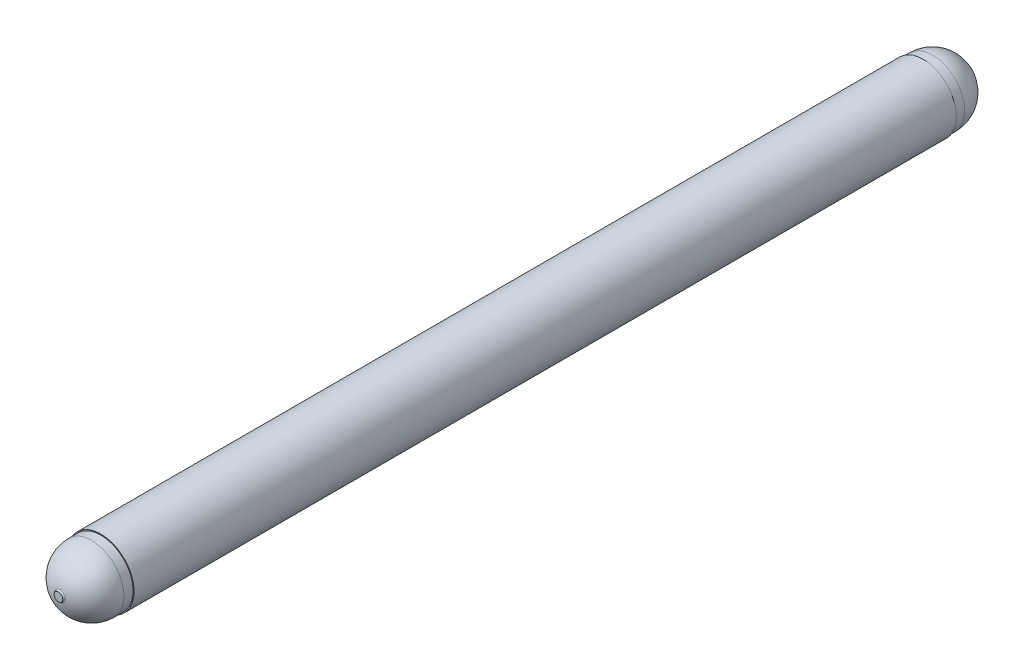
ISO-10303-21;
HEADER;
FILE_DESCRIPTION(('STEP AP214'),'2;1');
FILE_NAME('part.step','',(''),(''),'','','');
FILE_SCHEMA(('AUTOMOTIVE_DESIGN { 1 0 10303 214 1 1 1 1 }'));
ENDSEC;
DATA;
#1=APPLICATION_CONTEXT('core data for automotive mechanical design processes');
#2=APPLICATION_PROTOCOL_DEFINITION('international standard','automotive_design',2000,#1);
#3=PRODUCT_CONTEXT('',#1,'mechanical');
#4=PRODUCT('Part','Part','',(#3));
#5=PRODUCT_RELATED_PRODUCT_CATEGORY('part','',(#4));
#6=PRODUCT_DEFINITION_FORMATION('','',#4);
#7=PRODUCT_DEFINITION_CONTEXT('part definition',#1,'design');
#8=PRODUCT_DEFINITION('design','',#6,#7);
#9=PRODUCT_DEFINITION_SHAPE('','',#8);
#10=(LENGTH_UNIT() NAMED_UNIT(*) SI_UNIT(.MILLI.,.METRE.));
#11=(NAMED_UNIT(*) PLANE_ANGLE_UNIT() SI_UNIT($,.RADIAN.));
#12=(NAMED_UNIT(*) SI_UNIT($,.STERADIAN.) SOLID_ANGLE_UNIT());
#13=UNCERTAINTY_MEASURE_WITH_UNIT(LENGTH_MEASURE(1.E-05),#10,'distance_accuracy_value','');
#14=(GEOMETRIC_REPRESENTATION_CONTEXT(3) GLOBAL_UNCERTAINTY_ASSIGNED_CONTEXT((#13)) GLOBAL_UNIT_ASSIGNED_CONTEXT((#10,
#11,#12)) REPRESENTATION_CONTEXT('',''));
#15=CARTESIAN_POINT('',(0.,0.,0.));
#16=DIRECTION('',(0.,0.,1.));
#17=DIRECTION('',(1.,0.,0.));
#18=AXIS2_PLACEMENT_3D('',#15,#16,#17);
#19=CARTESIAN_POINT('',(0.,0.,-82.4767160886856));
#20=DIRECTION('',(0.,0.,-1.));
#21=DIRECTION('',(-1.,0.,0.));
#22=AXIS2_PLACEMENT_3D('',#19,#20,#21);
#23=PLANE('',#22);
#24=CARTESIAN_POINT('',(0.,0.,-82.4767160886856));
#25=DIRECTION('',(0.,0.,1.));
#26=DIRECTION('',(1.,0.,0.));
#27=AXIS2_PLACEMENT_3D('',#24,#25,#26);
#28=CIRCLE('',#27,5.725);
#29=CARTESIAN_POINT('',(5.725,0.,-82.4767160886856));
#30=VERTEX_POINT('',#29);
#31=EDGE_CURVE('E51',#30,#30,#28,.T.);
#32=ORIENTED_EDGE('',*,*,#31,.F.);
#33=EDGE_LOOP('',(#32));
#34=FACE_BOUND('',#33,.T.);
#35=ADVANCED_FACE('F30',(#34),#23,.T.);
#36=CARTESIAN_POINT('',(0.,0.,0.));
#37=DIRECTION('',(0.,0.,1.));
#38=DIRECTION('',(1.,0.,0.));
#39=AXIS2_PLACEMENT_3D('',#36,#37,#38);
#40=CYLINDRICAL_SURFACE('',#39,70.);
#41=CARTESIAN_POINT('',(0.,0.,-9.99999999999954));
#42=DIRECTION('',(0.,0.,1.));
#43=DIRECTION('',(1.,0.,0.));
#44=AXIS2_PLACEMENT_3D('',#41,#42,#43);
#45=CIRCLE('',#44,70.);
#46=CARTESIAN_POINT('',(70.,0.,-9.99999999999954));
#47=VERTEX_POINT('',#46);
#48=EDGE_CURVE('E58',#47,#47,#45,.T.);
#49=ORIENTED_EDGE('',*,*,#48,.T.);
#50=EDGE_LOOP('',(#49));
#51=FACE_BOUND('',#50,.T.);
#52=CARTESIAN_POINT('',(0.,0.,10.));
#53=DIRECTION('',(0.,0.,1.));
#54=DIRECTION('',(1.,0.,0.));
#55=AXIS2_PLACEMENT_3D('',#52,#53,#54);
#56=CIRCLE('',#55,70.);
#57=CARTESIAN_POINT('',(70.,0.,10.));
#58=VERTEX_POINT('',#57);
#59=EDGE_CURVE('E55',#58,#58,#56,.T.);
#60=ORIENTED_EDGE('',*,*,#59,.F.);
#61=EDGE_LOOP('',(#60));
#62=FACE_BOUND('',#61,.T.);
#63=ADVANCED_FACE('F72',(#51,#62),#40,.T.);
#64=CARTESIAN_POINT('',(0.,0.,-9.99999999999955));
#65=DIRECTION('',(0.,0.,1.));
#66=DIRECTION('',(-1.,0.,0.));
#67=AXIS2_PLACEMENT_3D('',#64,#65,#66);
#68=SPHERICAL_SURFACE('',#67,70.);
#69=CARTESIAN_POINT('',(0.,0.,-79.4982209069587));
#70=DIRECTION('',(0.,0.,1.));
#71=DIRECTION('',(1.,0.,0.));
#72=AXIS2_PLACEMENT_3D('',#69,#70,#71);
#73=CIRCLE('',#72,8.36643835616438);
#74=CARTESIAN_POINT('',(8.36643835616438,0.,-79.4982209069587));
#75=VERTEX_POINT('',#74);
#76=EDGE_CURVE('E34',#75,#75,#73,.F.);
#77=ORIENTED_EDGE('',*,*,#76,.F.);
#78=EDGE_LOOP('',(#77));
#79=FACE_BOUND('',#78,.T.);
#80=ORIENTED_EDGE('',*,*,#48,.F.);
#81=EDGE_LOOP('',(#80));
#82=FACE_BOUND('',#81,.T.);
#83=ADVANCED_FACE('F68',(#79,#82),#68,.T.);
#84=CARTESIAN_POINT('',(-72.,0.,10.));
#85=DIRECTION('',(0.,0.,-1.));
#86=DIRECTION('',(-1.,0.,0.));
#87=AXIS2_PLACEMENT_3D('',#84,#85,#86);
#88=PLANE('',#87);
#89=ORIENTED_EDGE('',*,*,#59,.T.);
#90=EDGE_LOOP('',(#89));
#91=FACE_BOUND('',#90,.T.);
#92=CARTESIAN_POINT('',(0.,0.,10.));
#93=DIRECTION('',(0.,0.,1.));
#94=DIRECTION('',(1.,0.,0.));
#95=AXIS2_PLACEMENT_3D('',#92,#93,#94);
#96=CIRCLE('',#95,72.);
#97=CARTESIAN_POINT('',(72.,0.,10.));
#98=VERTEX_POINT('',#97);
#99=EDGE_CURVE('E50',#98,#98,#96,.T.);
#100=ORIENTED_EDGE('',*,*,#99,.F.);
#101=EDGE_LOOP('',(#100));
#102=FACE_BOUND('',#101,.T.);
#103=ADVANCED_FACE('F71',(#91,#102),#88,.T.);
#104=CARTESIAN_POINT('',(0.,0.,-82.4767160886856));
#105=DIRECTION('',(0.,0.,1.));
#106=DIRECTION('',(1.,0.,0.));
#107=AXIS2_PLACEMENT_3D('',#104,#105,#106);
#108=TOROIDAL_SURFACE('',#107,8.725,3.);
#109=ORIENTED_EDGE('',*,*,#76,.T.);
#110=EDGE_LOOP('',(#109));
#111=FACE_BOUND('',#110,.T.);
#112=ORIENTED_EDGE('',*,*,#31,.T.);
#113=EDGE_LOOP('',(#112));
#114=FACE_BOUND('',#113,.T.);
#115=ADVANCED_FACE('F66',(#111,#114),#108,.F.);
#116=CARTESIAN_POINT('',(0.,0.,-286.123469070411));
#117=DIRECTION('',(0.,0.,1.));
#118=DIRECTION('',(1.,0.,0.));
#119=AXIS2_PLACEMENT_3D('',#116,#117,#118);
#120=CYLINDRICAL_SURFACE('',#119,72.);
#121=CARTESIAN_POINT('',(0.,0.,1794.));
#122=DIRECTION('',(0.,0.,-1.));
#123=DIRECTION('',(1.,0.,0.));
#124=AXIS2_PLACEMENT_3D('',#121,#122,#123);
#125=CIRCLE('',#124,72.);
#126=CARTESIAN_POINT('',(72.,0.,1794.));
#127=VERTEX_POINT('',#126);
#128=EDGE_CURVE('E47',#127,#127,#125,.T.);
#129=ORIENTED_EDGE('',*,*,#128,.T.);
#130=EDGE_LOOP('',(#129));
#131=FACE_BOUND('',#130,.T.);
#132=ORIENTED_EDGE('',*,*,#99,.T.);
#133=EDGE_LOOP('',(#132));
#134=FACE_BOUND('',#133,.T.);
#135=ADVANCED_FACE('F32',(#131,#134),#120,.T.);
#136=CARTESIAN_POINT('',(0.,0.,1814.));
#137=DIRECTION('',(0.,0.,-1.));
#138=DIRECTION('',(-1.,0.,0.));
#139=AXIS2_PLACEMENT_3D('',#136,#137,#138);
#140=SPHERICAL_SURFACE('',#139,70.);
#141=CARTESIAN_POINT('',(0.,0.,1882.99673748613));
#142=DIRECTION('',(0.,0.,-1.));
#143=DIRECTION('',(1.,0.,0.));
#144=AXIS2_PLACEMENT_3D('',#141,#142,#143);
#145=CIRCLE('',#144,11.808904109589);
#146=CARTESIAN_POINT('',(11.808904109589,0.,1882.99673748613));
#147=VERTEX_POINT('',#146);
#148=EDGE_CURVE('E54',#147,#147,#145,.F.);
#149=ORIENTED_EDGE('',*,*,#148,.F.);
#150=EDGE_LOOP('',(#149));
#151=FACE_BOUND('',#150,.T.);
#152=CARTESIAN_POINT('',(0.,0.,1814.));
#153=DIRECTION('',(0.,0.,-1.));
#154=DIRECTION('',(1.,0.,0.));
#155=AXIS2_PLACEMENT_3D('',#152,#153,#154);
#156=CIRCLE('',#155,70.);
#157=CARTESIAN_POINT('',(70.,0.,1814.));
#158=VERTEX_POINT('',#157);
#159=EDGE_CURVE('E38',#158,#158,#156,.T.);
#160=ORIENTED_EDGE('',*,*,#159,.F.);
#161=EDGE_LOOP('',(#160));
#162=FACE_BOUND('',#161,.T.);
#163=ADVANCED_FACE('F87',(#151,#162),#140,.T.);
#164=CARTESIAN_POINT('',(0.,0.,1885.95374052125));
#165=DIRECTION('',(0.,0.,-1.));
#166=DIRECTION('',(1.,0.,0.));
#167=AXIS2_PLACEMENT_3D('',#164,#165,#166);
#168=TOROIDAL_SURFACE('',#167,12.315,3.);
#169=ORIENTED_EDGE('',*,*,#148,.T.);
#170=EDGE_LOOP('',(#169));
#171=FACE_BOUND('',#170,.T.);
#172=CARTESIAN_POINT('',(0.,0.,1885.95374052125));
#173=DIRECTION('',(0.,0.,-1.));
#174=DIRECTION('',(1.,0.,0.));
#175=AXIS2_PLACEMENT_3D('',#172,#173,#174);
#176=CIRCLE('',#175,9.315);
#177=CARTESIAN_POINT('',(9.315,0.,1885.95374052125));
#178=VERTEX_POINT('',#177);
#179=EDGE_CURVE('E43',#178,#178,#176,.T.);
#180=ORIENTED_EDGE('',*,*,#179,.T.);
#181=EDGE_LOOP('',(#180));
#182=FACE_BOUND('',#181,.T.);
#183=ADVANCED_FACE('F93',(#171,#182),#168,.F.);
#184=CARTESIAN_POINT('',(0.,0.,1804.));
#185=DIRECTION('',(0.,0.,-1.));
#186=DIRECTION('',(1.,0.,0.));
#187=AXIS2_PLACEMENT_3D('',#184,#185,#186);
#188=CYLINDRICAL_SURFACE('',#187,70.);
#189=CARTESIAN_POINT('',(0.,0.,1794.));
#190=DIRECTION('',(0.,0.,-1.));
#191=DIRECTION('',(1.,0.,0.));
#192=AXIS2_PLACEMENT_3D('',#189,#190,#191);
#193=CIRCLE('',#192,70.);
#194=CARTESIAN_POINT('',(70.,0.,1794.));
#195=VERTEX_POINT('',#194);
#196=EDGE_CURVE('E10',#195,#195,#193,.T.);
#197=CARTESIAN_POINT('',(70.,0.,1814.));
#198=CARTESIAN_POINT('',(70.,0.,1813.79166666667));
#199=CARTESIAN_POINT('',(70.,0.,1813.58333333333));
#200=CARTESIAN_POINT('',(70.,0.,1813.16666666667));
#201=CARTESIAN_POINT('',(70.,0.,1812.95833333333));
#202=CARTESIAN_POINT('',(70.,0.,1812.54166666667));
#203=CARTESIAN_POINT('',(70.,0.,1812.33333333333));
#204=CARTESIAN_POINT('',(70.,0.,1811.91666666667));
#205=CARTESIAN_POINT('',(70.,0.,1811.70833333333));
#206=CARTESIAN_POINT('',(70.,0.,1811.29166666667));
#207=CARTESIAN_POINT('',(70.,0.,1811.08333333333));
#208=CARTESIAN_POINT('',(70.,0.,1810.66666666667));
#209=CARTESIAN_POINT('',(70.,0.,1810.45833333333));
#210=CARTESIAN_POINT('',(70.,0.,1810.04166666667));
#211=CARTESIAN_POINT('',(70.,0.,1809.83333333333));
#212=CARTESIAN_POINT('',(70.,0.,1809.41666666667));
#213=CARTESIAN_POINT('',(70.,0.,1809.20833333333));
#214=CARTESIAN_POINT('',(70.,0.,1808.79166666667));
#215=CARTESIAN_POINT('',(70.,0.,1808.58333333333));
#216=CARTESIAN_POINT('',(70.,0.,1808.16666666667));
#217=CARTESIAN_POINT('',(70.,0.,1807.95833333333));
#218=CARTESIAN_POINT('',(70.,0.,1807.54166666667));
#219=CARTESIAN_POINT('',(70.,0.,1807.33333333333));
#220=CARTESIAN_POINT('',(70.,0.,1806.91666666667));
#221=CARTESIAN_POINT('',(70.,0.,1806.70833333333));
#222=CARTESIAN_POINT('',(70.,0.,1806.29166666667));
#223=CARTESIAN_POINT('',(70.,0.,1806.08333333333));
#224=CARTESIAN_POINT('',(70.,0.,1805.66666666667));
#225=CARTESIAN_POINT('',(70.,0.,1805.45833333333));
#226=CARTESIAN_POINT('',(70.,0.,1805.04166666667));
#227=CARTESIAN_POINT('',(70.,0.,1804.83333333333));
#228=CARTESIAN_POINT('',(70.,0.,1804.41666666667));
#229=CARTESIAN_POINT('',(70.,0.,1804.20833333333));
#230=CARTESIAN_POINT('',(70.,0.,1803.79166666667));
#231=CARTESIAN_POINT('',(70.,0.,1803.58333333333));
#232=CARTESIAN_POINT('',(70.,0.,1803.16666666667));
#233=CARTESIAN_POINT('',(70.,0.,1802.95833333333));
#234=CARTESIAN_POINT('',(70.,0.,1802.54166666667));
#235=CARTESIAN_POINT('',(70.,0.,1802.33333333333));
#236=CARTESIAN_POINT('',(70.,0.,1801.91666666667));
#237=CARTESIAN_POINT('',(70.,0.,1801.70833333333));
#238=CARTESIAN_POINT('',(70.,0.,1801.29166666667));
#239=CARTESIAN_POINT('',(70.,0.,1801.08333333333));
#240=CARTESIAN_POINT('',(70.,0.,1800.66666666667));
#241=CARTESIAN_POINT('',(70.,0.,1800.45833333333));
#242=CARTESIAN_POINT('',(70.,0.,1800.04166666667));
#243=CARTESIAN_POINT('',(70.,0.,1799.83333333333));
#244=CARTESIAN_POINT('',(70.,0.,1799.41666666667));
#245=CARTESIAN_POINT('',(70.,0.,1799.20833333333));
#246=CARTESIAN_POINT('',(70.,0.,1798.79166666667));
#247=CARTESIAN_POINT('',(70.,0.,1798.58333333333));
#248=CARTESIAN_POINT('',(70.,0.,1798.16666666667));
#249=CARTESIAN_POINT('',(70.,0.,1797.95833333333));
#250=CARTESIAN_POINT('',(70.,0.,1797.54166666667));
#251=CARTESIAN_POINT('',(70.,0.,1797.33333333333));
#252=CARTESIAN_POINT('',(70.,0.,1796.91666666667));
#253=CARTESIAN_POINT('',(70.,0.,1796.70833333333));
#254=CARTESIAN_POINT('',(70.,0.,1796.29166666667));
#255=CARTESIAN_POINT('',(70.,0.,1796.08333333333));
#256=CARTESIAN_POINT('',(70.,0.,1795.66666666667));
#257=CARTESIAN_POINT('',(70.,0.,1795.45833333333));
#258=CARTESIAN_POINT('',(70.,0.,1795.04166666667));
#259=CARTESIAN_POINT('',(70.,0.,1794.83333333333));
#260=CARTESIAN_POINT('',(70.,0.,1794.41666666667));
#261=CARTESIAN_POINT('',(70.,0.,1794.20833333333));
#262=CARTESIAN_POINT('',(70.,0.,1794.));
#263=B_SPLINE_CURVE_WITH_KNOTS('',3,(#197,#198,#199,#200,#201,#202,#203,#204,#205,#206,#207,
#208,#209,#210,#211,#212,#213,#214,#215,#216,#217,#218,#219,#220,#221,#222,#223,#224,#225,#226,
#227,#228,#229,#230,#231,#232,#233,#234,#235,#236,#237,#238,#239,#240,#241,#242,#243,#244,#245,
#246,#247,#248,#249,#250,#251,#252,#253,#254,#255,#256,#257,#258,#259,#260,#261,#262),
.UNSPECIFIED.,.F.,.F.,(4,2,2,2,2,2,2,2,2,2,2,2,2,2,2,2,2,2,2,2,2,2,2,2,2,2,2,2,2,2,2,2,4),(0.,
0.624999999999876,1.24999999999997,1.87499999999985,2.49999999999995,3.12499999999982,
3.74999999999992,4.3749999999998,4.99999999999989,5.62499999999977,6.24999999999987,
6.87499999999974,7.49999999999984,8.12499999999972,8.74999999999981,9.37499999999969,
9.99999999999979,10.6249999999997,11.2499999999998,11.8749999999996,12.4999999999997,
13.1249999999996,13.7499999999997,14.3749999999996,14.9999999999997,15.6249999999996,
16.2499999999997,16.8749999999995,17.4999999999996,18.1249999999995,18.7499999999996,
19.3749999999995,19.9999999999996),.UNSPECIFIED.);
#264=EDGE_CURVE('BSEAM109',#158,#195,#263,.T.);
#265=ORIENTED_EDGE('',*,*,#159,.T.);
#266=ORIENTED_EDGE('',*,*,#196,.F.);
#267=ORIENTED_EDGE('',*,*,#264,.T.);
#268=ORIENTED_EDGE('',*,*,#264,.F.);
#269=EDGE_LOOP('',(#265,#267,#266,#268));
#270=FACE_BOUND('',#269,.T.);
#271=ADVANCED_FACE('F109',(#270),#188,.T.);
#272=CARTESIAN_POINT('',(-72.,0.,1794.));
#273=DIRECTION('',(0.,0.,1.));
#274=DIRECTION('',(-1.,0.,0.));
#275=AXIS2_PLACEMENT_3D('',#272,#273,#274);
#276=PLANE('',#275);
#277=ORIENTED_EDGE('',*,*,#196,.T.);
#278=EDGE_LOOP('',(#277));
#279=FACE_BOUND('',#278,.T.);
#280=ORIENTED_EDGE('',*,*,#128,.F.);
#281=EDGE_LOOP('',(#280));
#282=FACE_BOUND('',#281,.T.);
#283=ADVANCED_FACE('F104',(#279,#282),#276,.T.);
#284=CARTESIAN_POINT('',(0.,0.,1885.95374052125));
#285=DIRECTION('',(0.,0.,1.));
#286=DIRECTION('',(0.,-1.,0.));
#287=AXIS2_PLACEMENT_3D('',#284,#285,#286);
#288=PLANE('',#287);
#289=ORIENTED_EDGE('',*,*,#179,.F.);
#290=EDGE_LOOP('',(#289));
#291=FACE_BOUND('',#290,.T.);
#292=ADVANCED_FACE('F102',(#291),#288,.T.);
#293=CLOSED_SHELL('',(#35,#63,#83,#103,#115,#135,#163,#183,#271,#283,#292));
#294=MANIFOLD_SOLID_BREP('B2',#293);
#295=ADVANCED_BREP_SHAPE_REPRESENTATION('',(#18,#294),#14);
#296=SHAPE_DEFINITION_REPRESENTATION(#9,#295);
ENDSEC;
END-ISO-10303-21;
